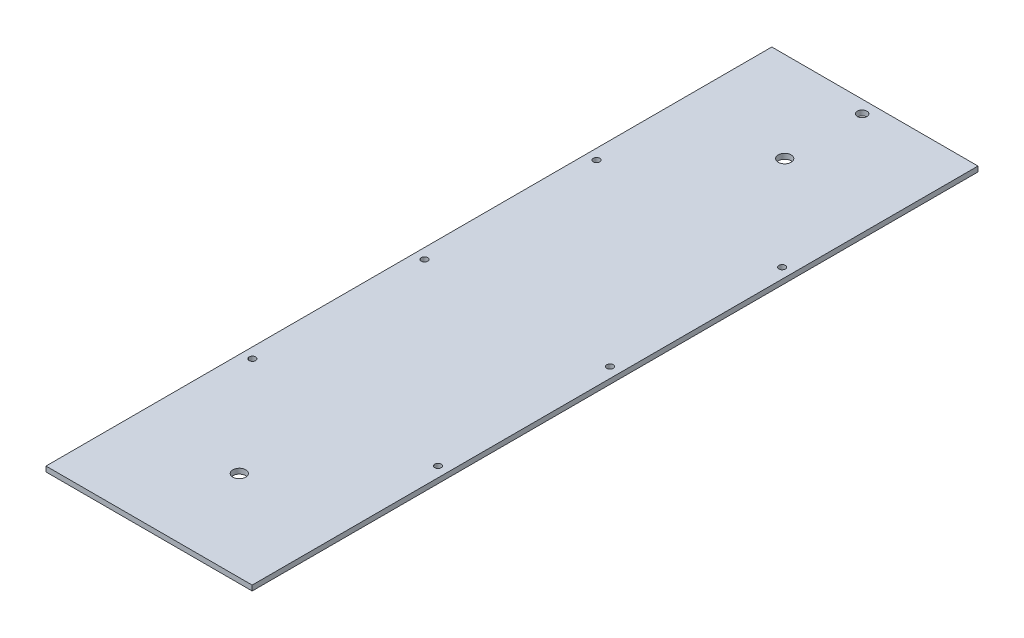
ISO-10303-21;
HEADER;
FILE_DESCRIPTION(('STEP AP214'),'2;1');
FILE_NAME('part.step','',(''),(''),'','','');
FILE_SCHEMA(('AUTOMOTIVE_DESIGN { 1 0 10303 214 1 1 1 1 }'));
ENDSEC;
DATA;
#1=APPLICATION_CONTEXT('core data for automotive mechanical design processes');
#2=APPLICATION_PROTOCOL_DEFINITION('international standard','automotive_design',2000,#1);
#3=PRODUCT_CONTEXT('',#1,'mechanical');
#4=PRODUCT('Part','Part','',(#3));
#5=PRODUCT_RELATED_PRODUCT_CATEGORY('part','',(#4));
#6=PRODUCT_DEFINITION_FORMATION('','',#4);
#7=PRODUCT_DEFINITION_CONTEXT('part definition',#1,'design');
#8=PRODUCT_DEFINITION('design','',#6,#7);
#9=PRODUCT_DEFINITION_SHAPE('','',#8);
#10=(LENGTH_UNIT() NAMED_UNIT(*) SI_UNIT(.MILLI.,.METRE.));
#11=(NAMED_UNIT(*) PLANE_ANGLE_UNIT() SI_UNIT($,.RADIAN.));
#12=(NAMED_UNIT(*) SI_UNIT($,.STERADIAN.) SOLID_ANGLE_UNIT());
#13=UNCERTAINTY_MEASURE_WITH_UNIT(LENGTH_MEASURE(1.E-05),#10,'distance_accuracy_value','');
#14=(GEOMETRIC_REPRESENTATION_CONTEXT(3) GLOBAL_UNCERTAINTY_ASSIGNED_CONTEXT((#13)) GLOBAL_UNIT_ASSIGNED_CONTEXT((#10,
#11,#12)) REPRESENTATION_CONTEXT('',''));
#15=CARTESIAN_POINT('',(0.,0.,0.));
#16=DIRECTION('',(0.,0.,1.));
#17=DIRECTION('',(1.,0.,0.));
#18=AXIS2_PLACEMENT_3D('',#15,#16,#17);
#19=CARTESIAN_POINT('',(0.,2.,0.));
#20=DIRECTION('',(0.,-1.,0.));
#21=DIRECTION('',(0.,0.,-1.));
#22=AXIS2_PLACEMENT_3D('',#19,#20,#21);
#23=PLANE('',#22);
#24=CARTESIAN_POINT('',(36.,2.,64.71));
#25=DIRECTION('',(0.,-1.,0.));
#26=DIRECTION('',(0.,0.,1.));
#27=AXIS2_PLACEMENT_3D('',#24,#25,#26);
#28=CIRCLE('',#27,1.25);
#29=CARTESIAN_POINT('',(36.,2.,65.96));
#30=VERTEX_POINT('',#29);
#31=EDGE_CURVE('E116',#30,#30,#28,.T.);
#32=ORIENTED_EDGE('',*,*,#31,.T.);
#33=EDGE_LOOP('',(#32));
#34=FACE_BOUND('',#33,.T.);
#35=CARTESIAN_POINT('',(36.,2.,-68.81));
#36=DIRECTION('',(0.,-1.,0.));
#37=DIRECTION('',(0.,0.,1.));
#38=AXIS2_PLACEMENT_3D('',#35,#36,#37);
#39=CIRCLE('',#38,1.25);
#40=CARTESIAN_POINT('',(36.,2.,-67.56));
#41=VERTEX_POINT('',#40);
#42=EDGE_CURVE('E137',#41,#41,#39,.T.);
#43=ORIENTED_EDGE('',*,*,#42,.T.);
#44=EDGE_LOOP('',(#43));
#45=FACE_BOUND('',#44,.T.);
#46=CARTESIAN_POINT('',(-36.,2.,-2.04999999999997));
#47=DIRECTION('',(0.,1.,0.));
#48=DIRECTION('',(0.,0.,1.));
#49=AXIS2_PLACEMENT_3D('',#46,#47,#48);
#50=CIRCLE('',#49,1.25);
#51=CARTESIAN_POINT('',(-36.,2.,-0.799999999999971));
#52=VERTEX_POINT('',#51);
#53=EDGE_CURVE('E148',#52,#52,#50,.T.);
#54=ORIENTED_EDGE('',*,*,#53,.F.);
#55=EDGE_LOOP('',(#54));
#56=FACE_BOUND('',#55,.T.);
#57=CARTESIAN_POINT('',(-36.,2.,-68.81));
#58=DIRECTION('',(0.,1.,0.));
#59=DIRECTION('',(0.,0.,1.));
#60=AXIS2_PLACEMENT_3D('',#57,#58,#59);
#61=CIRCLE('',#60,1.25);
#62=CARTESIAN_POINT('',(-36.,2.,-67.56));
#63=VERTEX_POINT('',#62);
#64=EDGE_CURVE('E151',#63,#63,#61,.T.);
#65=ORIENTED_EDGE('',*,*,#64,.F.);
#66=EDGE_LOOP('',(#65));
#67=FACE_BOUND('',#66,.T.);
#68=CARTESIAN_POINT('',(0.,2.,-135.87));
#69=DIRECTION('',(0.,1.,0.));
#70=DIRECTION('',(0.,0.,1.));
#71=AXIS2_PLACEMENT_3D('',#68,#69,#70);
#72=CIRCLE('',#71,1.84999999999999);
#73=CARTESIAN_POINT('',(0.,2.,-134.02));
#74=VERTEX_POINT('',#73);
#75=EDGE_CURVE('E155',#74,#74,#72,.T.);
#76=ORIENTED_EDGE('',*,*,#75,.F.);
#77=EDGE_LOOP('',(#76));
#78=FACE_BOUND('',#77,.T.);
#79=DIRECTION('',(0.,0.,-1.));
#80=VECTOR('',#79,1.);
#81=CARTESIAN_POINT('',(40.,2.,140.81));
#82=LINE('',#81,#80);
#83=CARTESIAN_POINT('',(40.,2.,140.81));
#84=VERTEX_POINT('',#83);
#85=CARTESIAN_POINT('',(40.,2.,-140.81));
#86=VERTEX_POINT('',#85);
#87=EDGE_CURVE('E88',#84,#86,#82,.T.);
#88=ORIENTED_EDGE('',*,*,#87,.T.);
#89=DIRECTION('',(-1.,0.,0.));
#90=VECTOR('',#89,1.);
#91=CARTESIAN_POINT('',(-40.,2.,-140.81));
#92=LINE('',#91,#90);
#93=CARTESIAN_POINT('',(-40.,2.,-140.81));
#94=VERTEX_POINT('',#93);
#95=EDGE_CURVE('E83',#86,#94,#92,.T.);
#96=ORIENTED_EDGE('',*,*,#95,.T.);
#97=DIRECTION('',(0.,0.,1.));
#98=VECTOR('',#97,1.);
#99=CARTESIAN_POINT('',(-40.,2.,140.81));
#100=LINE('',#99,#98);
#101=CARTESIAN_POINT('',(-40.,2.,140.81));
#102=VERTEX_POINT('',#101);
#103=EDGE_CURVE('E86',#94,#102,#100,.T.);
#104=ORIENTED_EDGE('',*,*,#103,.T.);
#105=DIRECTION('',(1.,0.,0.));
#106=VECTOR('',#105,1.);
#107=CARTESIAN_POINT('',(-40.,2.,140.81));
#108=LINE('',#107,#106);
#109=EDGE_CURVE('E52',#102,#84,#108,.T.);
#110=ORIENTED_EDGE('',*,*,#109,.T.);
#111=EDGE_LOOP('',(#88,#96,#104,#110));
#112=FACE_BOUND('',#111,.T.);
#113=CARTESIAN_POINT('',(-36.,2.,64.71));
#114=DIRECTION('',(0.,1.,0.));
#115=DIRECTION('',(0.,0.,1.));
#116=AXIS2_PLACEMENT_3D('',#113,#114,#115);
#117=CIRCLE('',#116,1.25);
#118=CARTESIAN_POINT('',(-36.,2.,65.96));
#119=VERTEX_POINT('',#118);
#120=EDGE_CURVE('E11',#119,#119,#117,.T.);
#121=ORIENTED_EDGE('',*,*,#120,.F.);
#122=EDGE_LOOP('',(#121));
#123=FACE_BOUND('',#122,.T.);
#124=CARTESIAN_POINT('',(36.,2.,-2.04999999999997));
#125=DIRECTION('',(0.,-1.,0.));
#126=DIRECTION('',(0.,0.,1.));
#127=AXIS2_PLACEMENT_3D('',#124,#125,#126);
#128=CIRCLE('',#127,1.25);
#129=CARTESIAN_POINT('',(36.,2.,-0.799999999999971));
#130=VERTEX_POINT('',#129);
#131=EDGE_CURVE('E132',#130,#130,#128,.T.);
#132=ORIENTED_EDGE('',*,*,#131,.T.);
#133=EDGE_LOOP('',(#132));
#134=FACE_BOUND('',#133,.T.);
#135=CARTESIAN_POINT('',(0.,2.,-105.81));
#136=DIRECTION('',(0.,1.,0.));
#137=DIRECTION('',(0.,0.,1.));
#138=AXIS2_PLACEMENT_3D('',#135,#136,#137);
#139=CIRCLE('',#138,2.5);
#140=CARTESIAN_POINT('',(0.,2.,-103.31));
#141=VERTEX_POINT('',#140);
#142=EDGE_CURVE('E117',#141,#141,#139,.T.);
#143=ORIENTED_EDGE('',*,*,#142,.F.);
#144=EDGE_LOOP('',(#143));
#145=FACE_BOUND('',#144,.T.);
#146=CARTESIAN_POINT('',(0.,2.,105.81));
#147=DIRECTION('',(0.,-1.,0.));
#148=DIRECTION('',(0.,0.,-1.));
#149=AXIS2_PLACEMENT_3D('',#146,#147,#148);
#150=CIRCLE('',#149,2.5);
#151=CARTESIAN_POINT('',(0.,2.,103.31));
#152=VERTEX_POINT('',#151);
#153=EDGE_CURVE('E128',#152,#152,#150,.T.);
#154=ORIENTED_EDGE('',*,*,#153,.T.);
#155=EDGE_LOOP('',(#154));
#156=FACE_BOUND('',#155,.T.);
#157=ADVANCED_FACE('F33',(#34,#45,#56,#67,#78,#112,#123,#134,#145,#156),#23,.F.);
#158=CARTESIAN_POINT('',(0.,0.,0.));
#159=DIRECTION('',(0.,-1.,0.));
#160=DIRECTION('',(0.,0.,-1.));
#161=AXIS2_PLACEMENT_3D('',#158,#159,#160);
#162=PLANE('',#161);
#163=CARTESIAN_POINT('',(36.,0.,64.71));
#164=DIRECTION('',(0.,-1.,0.));
#165=DIRECTION('',(0.,0.,1.));
#166=AXIS2_PLACEMENT_3D('',#163,#164,#165);
#167=CIRCLE('',#166,1.25);
#168=CARTESIAN_POINT('',(36.,0.,65.96));
#169=VERTEX_POINT('',#168);
#170=EDGE_CURVE('E121',#169,#169,#167,.T.);
#171=ORIENTED_EDGE('',*,*,#170,.F.);
#172=EDGE_LOOP('',(#171));
#173=FACE_BOUND('',#172,.T.);
#174=CARTESIAN_POINT('',(36.,0.,-68.81));
#175=DIRECTION('',(0.,-1.,0.));
#176=DIRECTION('',(0.,0.,1.));
#177=AXIS2_PLACEMENT_3D('',#174,#175,#176);
#178=CIRCLE('',#177,1.25);
#179=CARTESIAN_POINT('',(36.,0.,-67.56));
#180=VERTEX_POINT('',#179);
#181=EDGE_CURVE('E140',#180,#180,#178,.T.);
#182=ORIENTED_EDGE('',*,*,#181,.F.);
#183=EDGE_LOOP('',(#182));
#184=FACE_BOUND('',#183,.T.);
#185=CARTESIAN_POINT('',(-36.,0.,-2.04999999999997));
#186=DIRECTION('',(0.,1.,0.));
#187=DIRECTION('',(0.,0.,1.));
#188=AXIS2_PLACEMENT_3D('',#185,#186,#187);
#189=CIRCLE('',#188,1.25);
#190=CARTESIAN_POINT('',(-36.,0.,-0.799999999999971));
#191=VERTEX_POINT('',#190);
#192=EDGE_CURVE('E143',#191,#191,#189,.T.);
#193=ORIENTED_EDGE('',*,*,#192,.T.);
#194=EDGE_LOOP('',(#193));
#195=FACE_BOUND('',#194,.T.);
#196=CARTESIAN_POINT('',(-36.,0.,-68.81));
#197=DIRECTION('',(0.,1.,0.));
#198=DIRECTION('',(0.,0.,1.));
#199=AXIS2_PLACEMENT_3D('',#196,#197,#198);
#200=CIRCLE('',#199,1.25);
#201=CARTESIAN_POINT('',(-36.,0.,-67.56));
#202=VERTEX_POINT('',#201);
#203=EDGE_CURVE('E152',#202,#202,#200,.T.);
#204=ORIENTED_EDGE('',*,*,#203,.T.);
#205=EDGE_LOOP('',(#204));
#206=FACE_BOUND('',#205,.T.);
#207=CARTESIAN_POINT('',(0.,0.,-135.87));
#208=DIRECTION('',(0.,1.,0.));
#209=DIRECTION('',(0.,0.,1.));
#210=AXIS2_PLACEMENT_3D('',#207,#208,#209);
#211=CIRCLE('',#210,1.84999999999999);
#212=CARTESIAN_POINT('',(0.,0.,-134.02));
#213=VERTEX_POINT('',#212);
#214=EDGE_CURVE('E106',#213,#213,#211,.T.);
#215=ORIENTED_EDGE('',*,*,#214,.T.);
#216=EDGE_LOOP('',(#215));
#217=FACE_BOUND('',#216,.T.);
#218=DIRECTION('',(0.,0.,-1.));
#219=VECTOR('',#218,1.);
#220=CARTESIAN_POINT('',(40.,0.,140.81));
#221=LINE('',#220,#219);
#222=CARTESIAN_POINT('',(40.,0.,140.81));
#223=VERTEX_POINT('',#222);
#224=CARTESIAN_POINT('',(40.,0.,-140.81));
#225=VERTEX_POINT('',#224);
#226=EDGE_CURVE('E103',#223,#225,#221,.T.);
#227=ORIENTED_EDGE('',*,*,#226,.F.);
#228=DIRECTION('',(1.,0.,0.));
#229=VECTOR('',#228,1.);
#230=CARTESIAN_POINT('',(-40.,0.,140.81));
#231=LINE('',#230,#229);
#232=CARTESIAN_POINT('',(-40.,0.,140.81));
#233=VERTEX_POINT('',#232);
#234=EDGE_CURVE('E75',#233,#223,#231,.T.);
#235=ORIENTED_EDGE('',*,*,#234,.F.);
#236=DIRECTION('',(0.,0.,1.));
#237=VECTOR('',#236,1.);
#238=CARTESIAN_POINT('',(-40.,0.,140.81));
#239=LINE('',#238,#237);
#240=CARTESIAN_POINT('',(-40.,0.,-140.81));
#241=VERTEX_POINT('',#240);
#242=EDGE_CURVE('E69',#241,#233,#239,.T.);
#243=ORIENTED_EDGE('',*,*,#242,.F.);
#244=DIRECTION('',(-1.,0.,0.));
#245=VECTOR('',#244,1.);
#246=CARTESIAN_POINT('',(-40.,0.,-140.81));
#247=LINE('',#246,#245);
#248=EDGE_CURVE('E93',#225,#241,#247,.T.);
#249=ORIENTED_EDGE('',*,*,#248,.F.);
#250=EDGE_LOOP('',(#227,#235,#243,#249));
#251=FACE_BOUND('',#250,.T.);
#252=CARTESIAN_POINT('',(-36.,0.,64.71));
#253=DIRECTION('',(0.,1.,0.));
#254=DIRECTION('',(0.,0.,1.));
#255=AXIS2_PLACEMENT_3D('',#252,#253,#254);
#256=CIRCLE('',#255,1.25);
#257=CARTESIAN_POINT('',(-36.,0.,65.96));
#258=VERTEX_POINT('',#257);
#259=EDGE_CURVE('E43',#258,#258,#256,.T.);
#260=ORIENTED_EDGE('',*,*,#259,.T.);
#261=EDGE_LOOP('',(#260));
#262=FACE_BOUND('',#261,.T.);
#263=CARTESIAN_POINT('',(36.,0.,-2.04999999999997));
#264=DIRECTION('',(0.,-1.,0.));
#265=DIRECTION('',(0.,0.,1.));
#266=AXIS2_PLACEMENT_3D('',#263,#264,#265);
#267=CIRCLE('',#266,1.25);
#268=CARTESIAN_POINT('',(36.,0.,-0.799999999999971));
#269=VERTEX_POINT('',#268);
#270=EDGE_CURVE('E134',#269,#269,#267,.T.);
#271=ORIENTED_EDGE('',*,*,#270,.F.);
#272=EDGE_LOOP('',(#271));
#273=FACE_BOUND('',#272,.T.);
#274=CARTESIAN_POINT('',(0.,0.,-105.81));
#275=DIRECTION('',(0.,-1.,0.));
#276=DIRECTION('',(0.,0.,-1.));
#277=AXIS2_PLACEMENT_3D('',#274,#275,#276);
#278=CIRCLE('',#277,2.5);
#279=CARTESIAN_POINT('',(0.,0.,-108.31));
#280=VERTEX_POINT('',#279);
#281=EDGE_CURVE('E114',#280,#280,#278,.T.);
#282=ORIENTED_EDGE('',*,*,#281,.F.);
#283=EDGE_LOOP('',(#282));
#284=FACE_BOUND('',#283,.T.);
#285=CARTESIAN_POINT('',(0.,0.,105.81));
#286=DIRECTION('',(0.,-1.,0.));
#287=DIRECTION('',(0.,0.,-1.));
#288=AXIS2_PLACEMENT_3D('',#285,#286,#287);
#289=CIRCLE('',#288,2.5);
#290=CARTESIAN_POINT('',(0.,0.,103.31));
#291=VERTEX_POINT('',#290);
#292=EDGE_CURVE('E37',#291,#291,#289,.F.);
#293=ORIENTED_EDGE('',*,*,#292,.T.);
#294=EDGE_LOOP('',(#293));
#295=FACE_BOUND('',#294,.T.);
#296=ADVANCED_FACE('F166',(#173,#184,#195,#206,#217,#251,#262,#273,#284,#295),#162,.T.);
#297=CARTESIAN_POINT('',(40.,2.,140.81));
#298=DIRECTION('',(-1.,0.,0.));
#299=DIRECTION('',(0.,0.,1.));
#300=AXIS2_PLACEMENT_3D('',#297,#298,#299);
#301=PLANE('',#300);
#302=ORIENTED_EDGE('',*,*,#226,.T.);
#303=DIRECTION('',(0.,-1.,0.));
#304=VECTOR('',#303,1.);
#305=CARTESIAN_POINT('',(40.,2.,-140.81));
#306=LINE('',#305,#304);
#307=EDGE_CURVE('E94',#86,#225,#306,.T.);
#308=ORIENTED_EDGE('',*,*,#307,.F.);
#309=ORIENTED_EDGE('',*,*,#87,.F.);
#310=DIRECTION('',(0.,-1.,0.));
#311=VECTOR('',#310,1.);
#312=CARTESIAN_POINT('',(40.,2.,140.81));
#313=LINE('',#312,#311);
#314=EDGE_CURVE('E99',#84,#223,#313,.T.);
#315=ORIENTED_EDGE('',*,*,#314,.T.);
#316=EDGE_LOOP('',(#302,#308,#309,#315));
#317=FACE_BOUND('',#316,.T.);
#318=ADVANCED_FACE('F173',(#317),#301,.F.);
#319=CARTESIAN_POINT('',(-40.,2.,-140.81));
#320=DIRECTION('',(0.,0.,1.));
#321=DIRECTION('',(1.,0.,0.));
#322=AXIS2_PLACEMENT_3D('',#319,#320,#321);
#323=PLANE('',#322);
#324=ORIENTED_EDGE('',*,*,#248,.T.);
#325=DIRECTION('',(0.,-1.,0.));
#326=VECTOR('',#325,1.);
#327=CARTESIAN_POINT('',(-40.,2.,-140.81));
#328=LINE('',#327,#326);
#329=EDGE_CURVE('E91',#94,#241,#328,.T.);
#330=ORIENTED_EDGE('',*,*,#329,.F.);
#331=ORIENTED_EDGE('',*,*,#95,.F.);
#332=ORIENTED_EDGE('',*,*,#307,.T.);
#333=EDGE_LOOP('',(#324,#330,#331,#332));
#334=FACE_BOUND('',#333,.T.);
#335=ADVANCED_FACE('F92',(#334),#323,.F.);
#336=CARTESIAN_POINT('',(-40.,2.,140.81));
#337=DIRECTION('',(1.,0.,0.));
#338=DIRECTION('',(0.,0.,-1.));
#339=AXIS2_PLACEMENT_3D('',#336,#337,#338);
#340=PLANE('',#339);
#341=ORIENTED_EDGE('',*,*,#242,.T.);
#342=DIRECTION('',(0.,-1.,0.));
#343=VECTOR('',#342,1.);
#344=CARTESIAN_POINT('',(-40.,2.,140.81));
#345=LINE('',#344,#343);
#346=EDGE_CURVE('E95',#102,#233,#345,.T.);
#347=ORIENTED_EDGE('',*,*,#346,.F.);
#348=ORIENTED_EDGE('',*,*,#103,.F.);
#349=ORIENTED_EDGE('',*,*,#329,.T.);
#350=EDGE_LOOP('',(#341,#347,#348,#349));
#351=FACE_BOUND('',#350,.T.);
#352=ADVANCED_FACE('F97',(#351),#340,.F.);
#353=CARTESIAN_POINT('',(-40.,2.,140.81));
#354=DIRECTION('',(0.,0.,-1.));
#355=DIRECTION('',(-1.,0.,0.));
#356=AXIS2_PLACEMENT_3D('',#353,#354,#355);
#357=PLANE('',#356);
#358=ORIENTED_EDGE('',*,*,#234,.T.);
#359=ORIENTED_EDGE('',*,*,#314,.F.);
#360=ORIENTED_EDGE('',*,*,#109,.F.);
#361=ORIENTED_EDGE('',*,*,#346,.T.);
#362=EDGE_LOOP('',(#358,#359,#360,#361));
#363=FACE_BOUND('',#362,.T.);
#364=ADVANCED_FACE('F180',(#363),#357,.F.);
#365=CARTESIAN_POINT('',(0.,0.,-135.87));
#366=DIRECTION('',(0.,1.,0.));
#367=DIRECTION('',(0.,0.,1.));
#368=AXIS2_PLACEMENT_3D('',#365,#366,#367);
#369=CYLINDRICAL_SURFACE('',#368,1.84999999999999);
#370=ORIENTED_EDGE('',*,*,#214,.F.);
#371=EDGE_LOOP('',(#370));
#372=FACE_BOUND('',#371,.T.);
#373=ORIENTED_EDGE('',*,*,#75,.T.);
#374=EDGE_LOOP('',(#373));
#375=FACE_BOUND('',#374,.T.);
#376=ADVANCED_FACE('F163',(#372,#375),#369,.F.);
#377=CARTESIAN_POINT('',(-36.,0.,-68.81));
#378=DIRECTION('',(0.,1.,0.));
#379=DIRECTION('',(0.,0.,1.));
#380=AXIS2_PLACEMENT_3D('',#377,#378,#379);
#381=CYLINDRICAL_SURFACE('',#380,1.25);
#382=ORIENTED_EDGE('',*,*,#203,.F.);
#383=EDGE_LOOP('',(#382));
#384=FACE_BOUND('',#383,.T.);
#385=ORIENTED_EDGE('',*,*,#64,.T.);
#386=EDGE_LOOP('',(#385));
#387=FACE_BOUND('',#386,.T.);
#388=ADVANCED_FACE('F227',(#384,#387),#381,.F.);
#389=CARTESIAN_POINT('',(-36.,0.,-2.04999999999997));
#390=DIRECTION('',(0.,1.,0.));
#391=DIRECTION('',(0.,0.,1.));
#392=AXIS2_PLACEMENT_3D('',#389,#390,#391);
#393=CYLINDRICAL_SURFACE('',#392,1.25);
#394=ORIENTED_EDGE('',*,*,#192,.F.);
#395=EDGE_LOOP('',(#394));
#396=FACE_BOUND('',#395,.T.);
#397=ORIENTED_EDGE('',*,*,#53,.T.);
#398=EDGE_LOOP('',(#397));
#399=FACE_BOUND('',#398,.T.);
#400=ADVANCED_FACE('F225',(#396,#399),#393,.F.);
#401=CARTESIAN_POINT('',(-36.,0.,64.71));
#402=DIRECTION('',(0.,1.,0.));
#403=DIRECTION('',(0.,0.,1.));
#404=AXIS2_PLACEMENT_3D('',#401,#402,#403);
#405=CYLINDRICAL_SURFACE('',#404,1.25);
#406=ORIENTED_EDGE('',*,*,#259,.F.);
#407=EDGE_LOOP('',(#406));
#408=FACE_BOUND('',#407,.T.);
#409=ORIENTED_EDGE('',*,*,#120,.T.);
#410=EDGE_LOOP('',(#409));
#411=FACE_BOUND('',#410,.T.);
#412=ADVANCED_FACE('F35',(#408,#411),#405,.F.);
#413=CARTESIAN_POINT('',(36.,0.,-68.81));
#414=DIRECTION('',(0.,1.,0.));
#415=DIRECTION('',(0.,0.,1.));
#416=AXIS2_PLACEMENT_3D('',#413,#414,#415);
#417=CYLINDRICAL_SURFACE('',#416,1.25);
#418=ORIENTED_EDGE('',*,*,#181,.T.);
#419=EDGE_LOOP('',(#418));
#420=FACE_BOUND('',#419,.T.);
#421=ORIENTED_EDGE('',*,*,#42,.F.);
#422=EDGE_LOOP('',(#421));
#423=FACE_BOUND('',#422,.T.);
#424=ADVANCED_FACE('F220',(#420,#423),#417,.F.);
#425=CARTESIAN_POINT('',(36.,0.,-2.04999999999997));
#426=DIRECTION('',(0.,1.,0.));
#427=DIRECTION('',(0.,0.,1.));
#428=AXIS2_PLACEMENT_3D('',#425,#426,#427);
#429=CYLINDRICAL_SURFACE('',#428,1.25);
#430=ORIENTED_EDGE('',*,*,#270,.T.);
#431=EDGE_LOOP('',(#430));
#432=FACE_BOUND('',#431,.T.);
#433=ORIENTED_EDGE('',*,*,#131,.F.);
#434=EDGE_LOOP('',(#433));
#435=FACE_BOUND('',#434,.T.);
#436=ADVANCED_FACE('F216',(#432,#435),#429,.F.);
#437=CARTESIAN_POINT('',(36.,0.,64.71));
#438=DIRECTION('',(0.,1.,0.));
#439=DIRECTION('',(0.,0.,1.));
#440=AXIS2_PLACEMENT_3D('',#437,#438,#439);
#441=CYLINDRICAL_SURFACE('',#440,1.25);
#442=ORIENTED_EDGE('',*,*,#170,.T.);
#443=EDGE_LOOP('',(#442));
#444=FACE_BOUND('',#443,.T.);
#445=ORIENTED_EDGE('',*,*,#31,.F.);
#446=EDGE_LOOP('',(#445));
#447=FACE_BOUND('',#446,.T.);
#448=ADVANCED_FACE('F211',(#444,#447),#441,.F.);
#449=CARTESIAN_POINT('',(0.,-8.,-105.81));
#450=DIRECTION('',(0.,1.,0.));
#451=DIRECTION('',(0.,0.,1.));
#452=AXIS2_PLACEMENT_3D('',#449,#450,#451);
#453=CYLINDRICAL_SURFACE('',#452,2.5);
#454=ORIENTED_EDGE('',*,*,#281,.T.);
#455=EDGE_LOOP('',(#454));
#456=FACE_BOUND('',#455,.T.);
#457=ORIENTED_EDGE('',*,*,#142,.T.);
#458=EDGE_LOOP('',(#457));
#459=FACE_BOUND('',#458,.T.);
#460=ADVANCED_FACE('F203',(#456,#459),#453,.F.);
#461=CARTESIAN_POINT('',(0.,-8.,105.81));
#462=DIRECTION('',(0.,1.,0.));
#463=DIRECTION('',(0.,0.,1.));
#464=AXIS2_PLACEMENT_3D('',#461,#462,#463);
#465=CYLINDRICAL_SURFACE('',#464,2.5);
#466=ORIENTED_EDGE('',*,*,#292,.F.);
#467=EDGE_LOOP('',(#466));
#468=FACE_BOUND('',#467,.T.);
#469=ORIENTED_EDGE('',*,*,#153,.F.);
#470=EDGE_LOOP('',(#469));
#471=FACE_BOUND('',#470,.T.);
#472=ADVANCED_FACE('F200',(#468,#471),#465,.F.);
#473=CLOSED_SHELL('',(#157,#296,#318,#335,#352,#364,#376,#388,#400,#412,#424,#436,#448,#460,#472));
#474=MANIFOLD_SOLID_BREP('B2',#473);
#475=ADVANCED_BREP_SHAPE_REPRESENTATION('',(#18,#474),#14);
#476=SHAPE_DEFINITION_REPRESENTATION(#9,#475);
ENDSEC;
END-ISO-10303-21;
